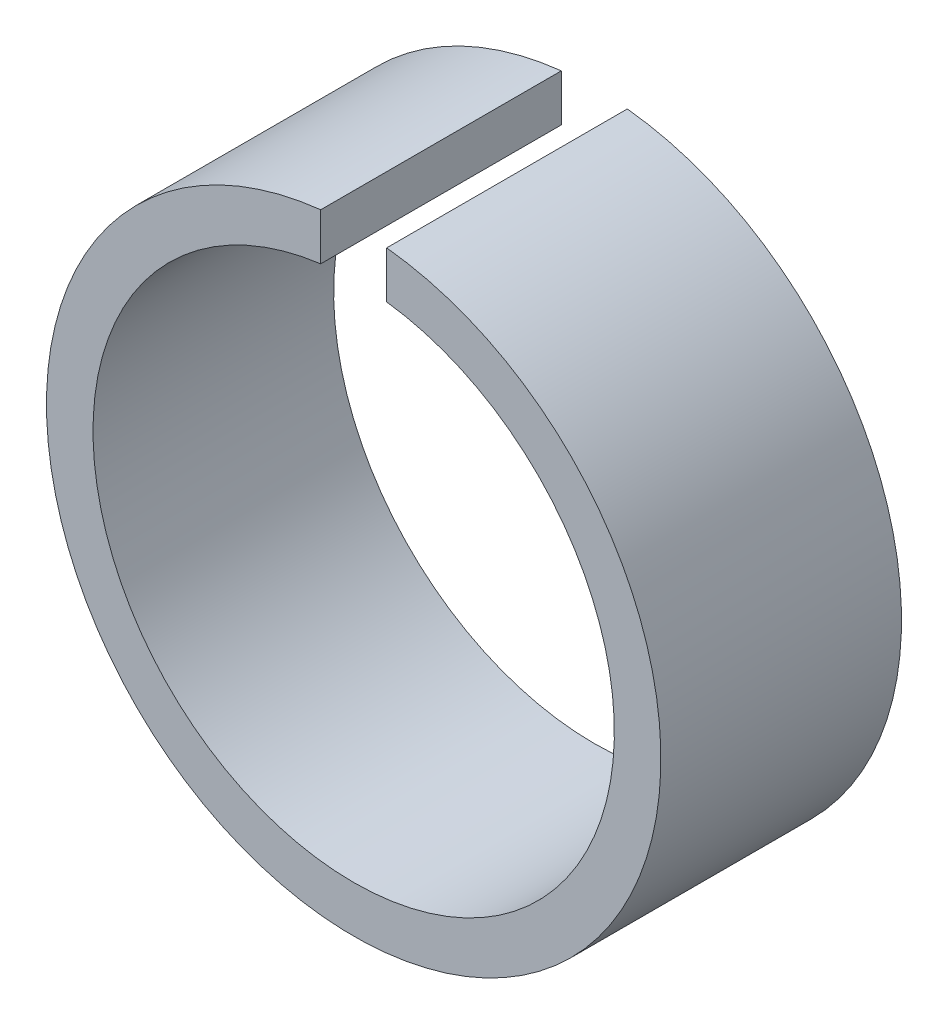
ISO-10303-21;
HEADER;
FILE_DESCRIPTION(('STEP AP214'),'2;1');
FILE_NAME('part.step','',(''),(''),'','','');
FILE_SCHEMA(('AUTOMOTIVE_DESIGN { 1 0 10303 214 1 1 1 1 }'));
ENDSEC;
DATA;
#1=APPLICATION_CONTEXT('core data for automotive mechanical design processes');
#2=APPLICATION_PROTOCOL_DEFINITION('international standard','automotive_design',2000,#1);
#3=PRODUCT_CONTEXT('',#1,'mechanical');
#4=PRODUCT('Part','Part','',(#3));
#5=PRODUCT_RELATED_PRODUCT_CATEGORY('part','',(#4));
#6=PRODUCT_DEFINITION_FORMATION('','',#4);
#7=PRODUCT_DEFINITION_CONTEXT('part definition',#1,'design');
#8=PRODUCT_DEFINITION('design','',#6,#7);
#9=PRODUCT_DEFINITION_SHAPE('','',#8);
#10=(LENGTH_UNIT() NAMED_UNIT(*) SI_UNIT(.MILLI.,.METRE.));
#11=(NAMED_UNIT(*) PLANE_ANGLE_UNIT() SI_UNIT($,.RADIAN.));
#12=(NAMED_UNIT(*) SI_UNIT($,.STERADIAN.) SOLID_ANGLE_UNIT());
#13=UNCERTAINTY_MEASURE_WITH_UNIT(LENGTH_MEASURE(1.E-05),#10,'distance_accuracy_value','');
#14=(GEOMETRIC_REPRESENTATION_CONTEXT(3) GLOBAL_UNCERTAINTY_ASSIGNED_CONTEXT((#13)) GLOBAL_UNIT_ASSIGNED_CONTEXT((#10,
#11,#12)) REPRESENTATION_CONTEXT('',''));
#15=CARTESIAN_POINT('',(0.,0.,0.));
#16=DIRECTION('',(0.,0.,1.));
#17=DIRECTION('',(1.,0.,0.));
#18=AXIS2_PLACEMENT_3D('',#15,#16,#17);
#19=CARTESIAN_POINT('',(0.,0.,19.05));
#20=DIRECTION('',(0.,0.,-1.));
#21=DIRECTION('',(-1.,0.,0.));
#22=AXIS2_PLACEMENT_3D('',#19,#20,#21);
#23=CYLINDRICAL_SURFACE('',#22,24.3205);
#24=CARTESIAN_POINT('',(0.,0.,0.));
#25=DIRECTION('',(0.,0.,1.));
#26=DIRECTION('',(1.,0.,0.));
#27=AXIS2_PLACEMENT_3D('',#24,#25,#26);
#28=CIRCLE('',#27,24.3205);
#29=CARTESIAN_POINT('',(-2.61203170324814,24.1798265219423,0.));
#30=VERTEX_POINT('',#29);
#31=CARTESIAN_POINT('',(2.61203170324814,24.1798265219423,0.));
#32=VERTEX_POINT('',#31);
#33=EDGE_CURVE('E95',#30,#32,#28,.T.);
#34=ORIENTED_EDGE('',*,*,#33,.T.);
#35=DIRECTION('',(0.,0.,-1.));
#36=VECTOR('',#35,1.);
#37=CARTESIAN_POINT('',(2.61203170324814,24.1798265219423,19.05));
#38=LINE('',#37,#36);
#39=CARTESIAN_POINT('',(2.61203170324814,24.1798265219423,19.05));
#40=VERTEX_POINT('',#39);
#41=EDGE_CURVE('E11',#40,#32,#38,.T.);
#42=ORIENTED_EDGE('',*,*,#41,.F.);
#43=CARTESIAN_POINT('',(0.,0.,19.05));
#44=DIRECTION('',(0.,0.,1.));
#45=DIRECTION('',(1.,0.,0.));
#46=AXIS2_PLACEMENT_3D('',#43,#44,#45);
#47=CIRCLE('',#46,24.3205);
#48=CARTESIAN_POINT('',(-2.61203170324814,24.1798265219423,19.05));
#49=VERTEX_POINT('',#48);
#50=EDGE_CURVE('E83',#49,#40,#47,.T.);
#51=ORIENTED_EDGE('',*,*,#50,.F.);
#52=DIRECTION('',(0.,0.,-1.));
#53=VECTOR('',#52,1.);
#54=CARTESIAN_POINT('',(-2.61203170324814,24.1798265219423,19.05));
#55=LINE('',#54,#53);
#56=EDGE_CURVE('E91',#49,#30,#55,.T.);
#57=ORIENTED_EDGE('',*,*,#56,.T.);
#58=EDGE_LOOP('',(#34,#42,#51,#57));
#59=FACE_BOUND('',#58,.T.);
#60=ADVANCED_FACE('F32',(#59),#23,.T.);
#61=CARTESIAN_POINT('',(2.61203170324814,24.1798265219423,19.05));
#62=DIRECTION('',(1.,0.,0.));
#63=DIRECTION('',(0.,0.,-1.));
#64=AXIS2_PLACEMENT_3D('',#61,#62,#63);
#65=PLANE('',#64);
#66=DIRECTION('',(0.,-1.,0.));
#67=VECTOR('',#66,1.);
#68=CARTESIAN_POINT('',(2.61203170324814,24.1798265219423,0.));
#69=LINE('',#68,#67);
#70=CARTESIAN_POINT('',(2.61203170324814,20.4715338123753,0.));
#71=VERTEX_POINT('',#70);
#72=EDGE_CURVE('E87',#32,#71,#69,.T.);
#73=ORIENTED_EDGE('',*,*,#72,.T.);
#74=DIRECTION('',(0.,0.,-1.));
#75=VECTOR('',#74,1.);
#76=CARTESIAN_POINT('',(2.61203170324814,20.4715338123753,19.05));
#77=LINE('',#76,#75);
#78=CARTESIAN_POINT('',(2.61203170324814,20.4715338123753,19.05));
#79=VERTEX_POINT('',#78);
#80=EDGE_CURVE('E40',#79,#71,#77,.T.);
#81=ORIENTED_EDGE('',*,*,#80,.F.);
#82=DIRECTION('',(0.,-1.,0.));
#83=VECTOR('',#82,1.);
#84=CARTESIAN_POINT('',(2.61203170324814,24.1798265219423,19.05));
#85=LINE('',#84,#83);
#86=EDGE_CURVE('E78',#40,#79,#85,.T.);
#87=ORIENTED_EDGE('',*,*,#86,.F.);
#88=ORIENTED_EDGE('',*,*,#41,.T.);
#89=EDGE_LOOP('',(#73,#81,#87,#88));
#90=FACE_BOUND('',#89,.T.);
#91=ADVANCED_FACE('F86',(#90),#65,.F.);
#92=CARTESIAN_POINT('',(0.,0.,19.05));
#93=DIRECTION('',(0.,0.,-1.));
#94=DIRECTION('',(-1.,0.,0.));
#95=AXIS2_PLACEMENT_3D('',#92,#93,#94);
#96=CYLINDRICAL_SURFACE('',#95,20.6375);
#97=CARTESIAN_POINT('',(0.,0.,0.));
#98=DIRECTION('',(0.,0.,-1.));
#99=DIRECTION('',(1.,0.,0.));
#100=AXIS2_PLACEMENT_3D('',#97,#98,#99);
#101=CIRCLE('',#100,20.6375);
#102=CARTESIAN_POINT('',(-2.61203170324814,20.4715338123753,0.));
#103=VERTEX_POINT('',#102);
#104=EDGE_CURVE('E65',#71,#103,#101,.T.);
#105=ORIENTED_EDGE('',*,*,#104,.T.);
#106=DIRECTION('',(0.,0.,-1.));
#107=VECTOR('',#106,1.);
#108=CARTESIAN_POINT('',(-2.61203170324814,20.4715338123753,19.05));
#109=LINE('',#108,#107);
#110=CARTESIAN_POINT('',(-2.61203170324814,20.4715338123753,19.05));
#111=VERTEX_POINT('',#110);
#112=EDGE_CURVE('E88',#111,#103,#109,.T.);
#113=ORIENTED_EDGE('',*,*,#112,.F.);
#114=CARTESIAN_POINT('',(0.,0.,19.05));
#115=DIRECTION('',(0.,0.,-1.));
#116=DIRECTION('',(1.,0.,0.));
#117=AXIS2_PLACEMENT_3D('',#114,#115,#116);
#118=CIRCLE('',#117,20.6375);
#119=EDGE_CURVE('E81',#79,#111,#118,.T.);
#120=ORIENTED_EDGE('',*,*,#119,.F.);
#121=ORIENTED_EDGE('',*,*,#80,.T.);
#122=EDGE_LOOP('',(#105,#113,#120,#121));
#123=FACE_BOUND('',#122,.T.);
#124=ADVANCED_FACE('F89',(#123),#96,.F.);
#125=CARTESIAN_POINT('',(-2.61203170324814,24.1798265219423,19.05));
#126=DIRECTION('',(-1.,0.,0.));
#127=DIRECTION('',(0.,0.,1.));
#128=AXIS2_PLACEMENT_3D('',#125,#126,#127);
#129=PLANE('',#128);
#130=DIRECTION('',(0.,1.,0.));
#131=VECTOR('',#130,1.);
#132=CARTESIAN_POINT('',(-2.61203170324814,24.1798265219423,0.));
#133=LINE('',#132,#131);
#134=EDGE_CURVE('E71',#103,#30,#133,.T.);
#135=ORIENTED_EDGE('',*,*,#134,.T.);
#136=ORIENTED_EDGE('',*,*,#56,.F.);
#137=DIRECTION('',(0.,1.,0.));
#138=VECTOR('',#137,1.);
#139=CARTESIAN_POINT('',(-2.61203170324814,24.1798265219423,19.05));
#140=LINE('',#139,#138);
#141=EDGE_CURVE('E48',#111,#49,#140,.T.);
#142=ORIENTED_EDGE('',*,*,#141,.F.);
#143=ORIENTED_EDGE('',*,*,#112,.T.);
#144=EDGE_LOOP('',(#135,#136,#142,#143));
#145=FACE_BOUND('',#144,.T.);
#146=ADVANCED_FACE('F102',(#145),#129,.F.);
#147=CARTESIAN_POINT('',(0.,0.,19.05));
#148=DIRECTION('',(0.,0.,1.));
#149=DIRECTION('',(1.,0.,0.));
#150=AXIS2_PLACEMENT_3D('',#147,#148,#149);
#151=PLANE('',#150);
#152=ORIENTED_EDGE('',*,*,#50,.T.);
#153=ORIENTED_EDGE('',*,*,#86,.T.);
#154=ORIENTED_EDGE('',*,*,#119,.T.);
#155=ORIENTED_EDGE('',*,*,#141,.T.);
#156=EDGE_LOOP('',(#152,#153,#154,#155));
#157=FACE_BOUND('',#156,.T.);
#158=ADVANCED_FACE('F79',(#157),#151,.T.);
#159=CARTESIAN_POINT('',(0.,0.,0.));
#160=DIRECTION('',(0.,0.,1.));
#161=DIRECTION('',(1.,0.,0.));
#162=AXIS2_PLACEMENT_3D('',#159,#160,#161);
#163=PLANE('',#162);
#164=ORIENTED_EDGE('',*,*,#33,.F.);
#165=ORIENTED_EDGE('',*,*,#134,.F.);
#166=ORIENTED_EDGE('',*,*,#104,.F.);
#167=ORIENTED_EDGE('',*,*,#72,.F.);
#168=EDGE_LOOP('',(#164,#165,#166,#167));
#169=FACE_BOUND('',#168,.T.);
#170=ADVANCED_FACE('F105',(#169),#163,.F.);
#171=CLOSED_SHELL('',(#60,#91,#124,#146,#158,#170));
#172=MANIFOLD_SOLID_BREP('B2',#171);
#173=ADVANCED_BREP_SHAPE_REPRESENTATION('',(#18,#172),#14);
#174=SHAPE_DEFINITION_REPRESENTATION(#9,#173);
ENDSEC;
END-ISO-10303-21;
